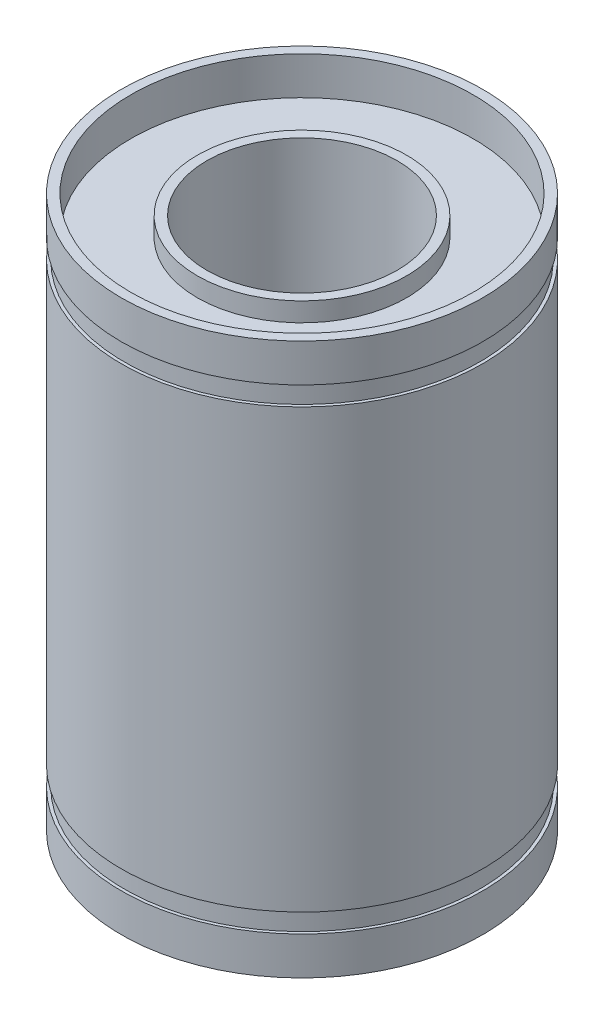
ISO-10303-21;
HEADER;
FILE_DESCRIPTION(('STEP AP214'),'2;1');
FILE_NAME('part.step','',(''),(''),'','','');
FILE_SCHEMA(('AUTOMOTIVE_DESIGN { 1 0 10303 214 1 1 1 1 }'));
ENDSEC;
DATA;
#1=APPLICATION_CONTEXT('core data for automotive mechanical design processes');
#2=APPLICATION_PROTOCOL_DEFINITION('international standard','automotive_design',2000,#1);
#3=PRODUCT_CONTEXT('',#1,'mechanical');
#4=PRODUCT('Part','Part','',(#3));
#5=PRODUCT_RELATED_PRODUCT_CATEGORY('part','',(#4));
#6=PRODUCT_DEFINITION_FORMATION('','',#4);
#7=PRODUCT_DEFINITION_CONTEXT('part definition',#1,'design');
#8=PRODUCT_DEFINITION('design','',#6,#7);
#9=PRODUCT_DEFINITION_SHAPE('','',#8);
#10=(LENGTH_UNIT() NAMED_UNIT(*) SI_UNIT(.MILLI.,.METRE.));
#11=(NAMED_UNIT(*) PLANE_ANGLE_UNIT() SI_UNIT($,.RADIAN.));
#12=(NAMED_UNIT(*) SI_UNIT($,.STERADIAN.) SOLID_ANGLE_UNIT());
#13=UNCERTAINTY_MEASURE_WITH_UNIT(LENGTH_MEASURE(1.E-05),#10,'distance_accuracy_value','');
#14=(GEOMETRIC_REPRESENTATION_CONTEXT(3) GLOBAL_UNCERTAINTY_ASSIGNED_CONTEXT((#13)) GLOBAL_UNIT_ASSIGNED_CONTEXT((#10,
#11,#12)) REPRESENTATION_CONTEXT('',''));
#15=CARTESIAN_POINT('',(0.,0.,0.));
#16=DIRECTION('',(0.,0.,1.));
#17=DIRECTION('',(1.,0.,0.));
#18=AXIS2_PLACEMENT_3D('',#15,#16,#17);
#19=CARTESIAN_POINT('',(0.,-19.,0.));
#20=DIRECTION('',(0.,-1.,0.));
#21=DIRECTION('',(0.,0.,-1.));
#22=AXIS2_PLACEMENT_3D('',#19,#20,#21);
#23=PLANE('',#22);
#24=CARTESIAN_POINT('',(0.,-19.,0.));
#25=DIRECTION('',(0.,-1.,0.));
#26=DIRECTION('',(0.,0.,-1.));
#27=AXIS2_PLACEMENT_3D('',#24,#25,#26);
#28=CIRCLE('',#27,9.);
#29=CARTESIAN_POINT('',(0.,-19.,-9.));
#30=VERTEX_POINT('',#29);
#31=EDGE_CURVE('E74',#30,#30,#28,.T.);
#32=ORIENTED_EDGE('',*,*,#31,.T.);
#33=EDGE_LOOP('',(#32));
#34=FACE_BOUND('',#33,.T.);
#35=CARTESIAN_POINT('',(0.,-19.,0.));
#36=DIRECTION('',(0.,-1.,0.));
#37=DIRECTION('',(0.,0.,-1.));
#38=AXIS2_PLACEMENT_3D('',#35,#36,#37);
#39=CIRCLE('',#38,5.5);
#40=CARTESIAN_POINT('',(0.,-19.,-5.5));
#41=VERTEX_POINT('',#40);
#42=EDGE_CURVE('E92',#41,#41,#39,.T.);
#43=ORIENTED_EDGE('',*,*,#42,.F.);
#44=EDGE_LOOP('',(#43));
#45=FACE_BOUND('',#44,.T.);
#46=ADVANCED_FACE('F32',(#34,#45),#23,.T.);
#47=CARTESIAN_POINT('',(0.,6.,0.));
#48=DIRECTION('',(0.,1.,0.));
#49=DIRECTION('',(0.,0.,1.));
#50=AXIS2_PLACEMENT_3D('',#47,#48,#49);
#51=PLANE('',#50);
#52=CARTESIAN_POINT('',(0.,6.,0.));
#53=DIRECTION('',(0.,1.,0.));
#54=DIRECTION('',(0.,0.,1.));
#55=AXIS2_PLACEMENT_3D('',#52,#53,#54);
#56=CIRCLE('',#55,9.);
#57=CARTESIAN_POINT('',(0.,6.,9.));
#58=VERTEX_POINT('',#57);
#59=EDGE_CURVE('E10',#58,#58,#56,.F.);
#60=ORIENTED_EDGE('',*,*,#59,.F.);
#61=EDGE_LOOP('',(#60));
#62=FACE_BOUND('',#61,.T.);
#63=CARTESIAN_POINT('',(0.,6.,0.));
#64=DIRECTION('',(0.,1.,0.));
#65=DIRECTION('',(0.,0.,1.));
#66=AXIS2_PLACEMENT_3D('',#63,#64,#65);
#67=CIRCLE('',#66,5.5);
#68=CARTESIAN_POINT('',(0.,6.,5.5));
#69=VERTEX_POINT('',#68);
#70=EDGE_CURVE('E83',#69,#69,#67,.T.);
#71=ORIENTED_EDGE('',*,*,#70,.F.);
#72=EDGE_LOOP('',(#71));
#73=FACE_BOUND('',#72,.T.);
#74=ADVANCED_FACE('F34',(#62,#73),#51,.T.);
#75=CARTESIAN_POINT('',(0.,8.,0.));
#76=DIRECTION('',(0.,-1.,0.));
#77=DIRECTION('',(0.,0.,-1.));
#78=AXIS2_PLACEMENT_3D('',#75,#76,#77);
#79=CYLINDRICAL_SURFACE('',#78,5.);
#80=CARTESIAN_POINT('',(0.,7.,0.));
#81=DIRECTION('',(0.,1.,0.));
#82=DIRECTION('',(0.,0.,1.));
#83=AXIS2_PLACEMENT_3D('',#80,#81,#82);
#84=CIRCLE('',#83,5.);
#85=CARTESIAN_POINT('',(0.,7.,-5.));
#86=VERTEX_POINT('',#85);
#87=EDGE_CURVE('E86',#86,#86,#84,.T.);
#88=CARTESIAN_POINT('',(0.,-20.,0.));
#89=DIRECTION('',(0.,-1.,0.));
#90=DIRECTION('',(0.,0.,-1.));
#91=AXIS2_PLACEMENT_3D('',#88,#89,#90);
#92=CIRCLE('',#91,5.);
#93=CARTESIAN_POINT('',(0.,-20.,-5.));
#94=VERTEX_POINT('',#93);
#95=EDGE_CURVE('E95',#94,#94,#92,.T.);
#96=CARTESIAN_POINT('',(0.,7.,-5.));
#97=CARTESIAN_POINT('',(0.,6.71875,-5.));
#98=CARTESIAN_POINT('',(0.,6.4375,-5.));
#99=CARTESIAN_POINT('',(0.,5.875,-5.));
#100=CARTESIAN_POINT('',(0.,5.59375,-5.));
#101=CARTESIAN_POINT('',(0.,5.03125,-5.));
#102=CARTESIAN_POINT('',(0.,4.75,-5.));
#103=CARTESIAN_POINT('',(0.,4.1875,-5.));
#104=CARTESIAN_POINT('',(0.,3.90625,-5.));
#105=CARTESIAN_POINT('',(0.,3.34375,-5.));
#106=CARTESIAN_POINT('',(0.,3.0625,-5.));
#107=CARTESIAN_POINT('',(0.,2.5,-5.));
#108=CARTESIAN_POINT('',(0.,2.21875,-5.));
#109=CARTESIAN_POINT('',(0.,1.65625,-5.));
#110=CARTESIAN_POINT('',(0.,1.375,-5.));
#111=CARTESIAN_POINT('',(0.,0.812500000000001,-5.));
#112=CARTESIAN_POINT('',(0.,0.531250000000001,-5.));
#113=CARTESIAN_POINT('',(0.,-0.0312499999999989,-5.));
#114=CARTESIAN_POINT('',(0.,-0.312499999999999,-5.));
#115=CARTESIAN_POINT('',(0.,-0.874999999999999,-5.));
#116=CARTESIAN_POINT('',(0.,-1.15625,-5.));
#117=CARTESIAN_POINT('',(0.,-1.71875,-5.));
#118=CARTESIAN_POINT('',(0.,-2.,-5.));
#119=CARTESIAN_POINT('',(0.,-2.5625,-5.));
#120=CARTESIAN_POINT('',(0.,-2.84375,-5.));
#121=CARTESIAN_POINT('',(0.,-3.40625,-5.));
#122=CARTESIAN_POINT('',(0.,-3.6875,-5.));
#123=CARTESIAN_POINT('',(0.,-4.25,-5.));
#124=CARTESIAN_POINT('',(0.,-4.53125,-5.));
#125=CARTESIAN_POINT('',(0.,-5.09375,-5.));
#126=CARTESIAN_POINT('',(0.,-5.375,-5.));
#127=CARTESIAN_POINT('',(0.,-5.9375,-5.));
#128=CARTESIAN_POINT('',(0.,-6.21875,-5.));
#129=CARTESIAN_POINT('',(0.,-6.78125,-5.));
#130=CARTESIAN_POINT('',(0.,-7.0625,-5.));
#131=CARTESIAN_POINT('',(0.,-7.625,-5.));
#132=CARTESIAN_POINT('',(0.,-7.90625,-5.));
#133=CARTESIAN_POINT('',(0.,-8.46875,-5.));
#134=CARTESIAN_POINT('',(0.,-8.75,-5.));
#135=CARTESIAN_POINT('',(0.,-9.3125,-5.));
#136=CARTESIAN_POINT('',(0.,-9.59375,-5.));
#137=CARTESIAN_POINT('',(0.,-10.15625,-5.));
#138=CARTESIAN_POINT('',(0.,-10.4375,-5.));
#139=CARTESIAN_POINT('',(0.,-11.,-5.));
#140=CARTESIAN_POINT('',(0.,-11.28125,-5.));
#141=CARTESIAN_POINT('',(0.,-11.84375,-5.));
#142=CARTESIAN_POINT('',(0.,-12.125,-5.));
#143=CARTESIAN_POINT('',(0.,-12.6875,-5.));
#144=CARTESIAN_POINT('',(0.,-12.96875,-5.));
#145=CARTESIAN_POINT('',(0.,-13.53125,-5.));
#146=CARTESIAN_POINT('',(0.,-13.8125,-5.));
#147=CARTESIAN_POINT('',(0.,-14.375,-5.));
#148=CARTESIAN_POINT('',(0.,-14.65625,-5.));
#149=CARTESIAN_POINT('',(0.,-15.21875,-5.));
#150=CARTESIAN_POINT('',(0.,-15.5,-5.));
#151=CARTESIAN_POINT('',(0.,-16.0625,-5.));
#152=CARTESIAN_POINT('',(0.,-16.34375,-5.));
#153=CARTESIAN_POINT('',(0.,-16.90625,-5.));
#154=CARTESIAN_POINT('',(0.,-17.1875,-5.));
#155=CARTESIAN_POINT('',(0.,-17.75,-5.));
#156=CARTESIAN_POINT('',(0.,-18.03125,-5.));
#157=CARTESIAN_POINT('',(0.,-18.59375,-5.));
#158=CARTESIAN_POINT('',(0.,-18.875,-5.));
#159=CARTESIAN_POINT('',(0.,-19.4375,-5.));
#160=CARTESIAN_POINT('',(0.,-19.71875,-5.));
#161=CARTESIAN_POINT('',(0.,-20.,-5.));
#162=B_SPLINE_CURVE_WITH_KNOTS('',3,(#96,#97,#98,#99,#100,#101,#102,#103,#104,#105,#106,#107,
#108,#109,#110,#111,#112,#113,#114,#115,#116,#117,#118,#119,#120,#121,#122,#123,#124,#125,#126,
#127,#128,#129,#130,#131,#132,#133,#134,#135,#136,#137,#138,#139,#140,#141,#142,#143,#144,#145,
#146,#147,#148,#149,#150,#151,#152,#153,#154,#155,#156,#157,#158,#159,#160,#161),.UNSPECIFIED.,
.F.,.F.,(4,2,2,2,2,2,2,2,2,2,2,2,2,2,2,2,2,2,2,2,2,2,2,2,2,2,2,2,2,2,2,2,4),(0.,0.84375,1.6875,
2.53125,3.375,4.21875,5.0625,5.90625,6.75,7.59375,8.4375,9.28125,10.125,10.96875,11.8125,
12.65625,13.5,14.34375,15.1875,16.03125,16.875,17.71875,18.5625,19.40625,20.25,21.09375,21.9375,
22.78125,23.625,24.46875,25.3125,26.15625,27.),.UNSPECIFIED.);
#163=EDGE_CURVE('BSEAM101',#86,#94,#162,.T.);
#164=ORIENTED_EDGE('',*,*,#87,.T.);
#165=ORIENTED_EDGE('',*,*,#95,.T.);
#166=ORIENTED_EDGE('',*,*,#163,.T.);
#167=ORIENTED_EDGE('',*,*,#163,.F.);
#168=EDGE_LOOP('',(#164,#166,#165,#167));
#169=FACE_BOUND('',#168,.T.);
#170=ADVANCED_FACE('F101',(#169),#79,.F.);
#171=CARTESIAN_POINT('',(0.,-18.,0.));
#172=DIRECTION('',(0.,-1.,0.));
#173=DIRECTION('',(0.,0.,-1.));
#174=AXIS2_PLACEMENT_3D('',#171,#172,#173);
#175=PLANE('',#174);
#176=CARTESIAN_POINT('',(0.,-18.,0.));
#177=DIRECTION('',(0.,-1.,0.));
#178=DIRECTION('',(0.,0.,-1.));
#179=AXIS2_PLACEMENT_3D('',#176,#177,#178);
#180=CIRCLE('',#179,9.5);
#181=CARTESIAN_POINT('',(0.,-18.,-9.5));
#182=VERTEX_POINT('',#181);
#183=EDGE_CURVE('E58',#182,#182,#180,.T.);
#184=ORIENTED_EDGE('',*,*,#183,.T.);
#185=EDGE_LOOP('',(#184));
#186=FACE_BOUND('',#185,.T.);
#187=CARTESIAN_POINT('',(0.,-18.,0.));
#188=DIRECTION('',(0.,-1.,0.));
#189=DIRECTION('',(0.,0.,-1.));
#190=AXIS2_PLACEMENT_3D('',#187,#188,#189);
#191=CIRCLE('',#190,9.34144595489267);
#192=CARTESIAN_POINT('',(0.,-18.,-9.34144595489267));
#193=VERTEX_POINT('',#192);
#194=EDGE_CURVE('E65',#193,#193,#191,.T.);
#195=ORIENTED_EDGE('',*,*,#194,.F.);
#196=EDGE_LOOP('',(#195));
#197=FACE_BOUND('',#196,.T.);
#198=ADVANCED_FACE('F135',(#186,#197),#175,.T.);
#199=CARTESIAN_POINT('',(0.,6.,0.));
#200=DIRECTION('',(0.,-1.,0.));
#201=DIRECTION('',(0.,0.,-1.));
#202=AXIS2_PLACEMENT_3D('',#199,#200,#201);
#203=CYLINDRICAL_SURFACE('',#202,9.34144595489267);
#204=CARTESIAN_POINT('',(0.,6.,0.));
#205=DIRECTION('',(0.,1.,0.));
#206=DIRECTION('',(0.,0.,1.));
#207=AXIS2_PLACEMENT_3D('',#204,#205,#206);
#208=CIRCLE('',#207,9.34144595489267);
#209=CARTESIAN_POINT('',(0.,6.,9.34144595489267));
#210=VERTEX_POINT('',#209);
#211=EDGE_CURVE('E39',#210,#210,#208,.F.);
#212=ORIENTED_EDGE('',*,*,#211,.T.);
#213=EDGE_LOOP('',(#212));
#214=FACE_BOUND('',#213,.T.);
#215=CARTESIAN_POINT('',(0.,5.,0.));
#216=DIRECTION('',(0.,-1.,0.));
#217=DIRECTION('',(0.,0.,-1.));
#218=AXIS2_PLACEMENT_3D('',#215,#216,#217);
#219=CIRCLE('',#218,9.34144595489267);
#220=CARTESIAN_POINT('',(0.,5.,-9.34144595489267));
#221=VERTEX_POINT('',#220);
#222=EDGE_CURVE('E55',#221,#221,#219,.T.);
#223=ORIENTED_EDGE('',*,*,#222,.F.);
#224=EDGE_LOOP('',(#223));
#225=FACE_BOUND('',#224,.T.);
#226=ADVANCED_FACE('F155',(#214,#225),#203,.T.);
#227=CARTESIAN_POINT('',(0.,8.,0.));
#228=DIRECTION('',(0.,1.,0.));
#229=DIRECTION('',(0.,0.,1.));
#230=AXIS2_PLACEMENT_3D('',#227,#228,#229);
#231=PLANE('',#230);
#232=CARTESIAN_POINT('',(0.,8.,0.));
#233=DIRECTION('',(0.,1.,0.));
#234=DIRECTION('',(0.,0.,1.));
#235=AXIS2_PLACEMENT_3D('',#232,#233,#234);
#236=CIRCLE('',#235,9.5);
#237=CARTESIAN_POINT('',(0.,8.,9.5));
#238=VERTEX_POINT('',#237);
#239=EDGE_CURVE('E43',#238,#238,#236,.T.);
#240=ORIENTED_EDGE('',*,*,#239,.T.);
#241=EDGE_LOOP('',(#240));
#242=FACE_BOUND('',#241,.T.);
#243=CARTESIAN_POINT('',(0.,8.,0.));
#244=DIRECTION('',(0.,1.,0.));
#245=DIRECTION('',(0.,0.,1.));
#246=AXIS2_PLACEMENT_3D('',#243,#244,#245);
#247=CIRCLE('',#246,9.);
#248=CARTESIAN_POINT('',(0.,8.,9.));
#249=VERTEX_POINT('',#248);
#250=EDGE_CURVE('E51',#249,#249,#247,.T.);
#251=ORIENTED_EDGE('',*,*,#250,.F.);
#252=EDGE_LOOP('',(#251));
#253=FACE_BOUND('',#252,.T.);
#254=ADVANCED_FACE('F169',(#242,#253),#231,.T.);
#255=CARTESIAN_POINT('',(0.,6.,0.));
#256=DIRECTION('',(0.,1.,0.));
#257=DIRECTION('',(0.,0.,1.));
#258=AXIS2_PLACEMENT_3D('',#255,#256,#257);
#259=PLANE('',#258);
#260=ORIENTED_EDGE('',*,*,#211,.F.);
#261=EDGE_LOOP('',(#260));
#262=FACE_BOUND('',#261,.T.);
#263=CARTESIAN_POINT('',(0.,6.,0.));
#264=DIRECTION('',(0.,1.,0.));
#265=DIRECTION('',(0.,0.,1.));
#266=AXIS2_PLACEMENT_3D('',#263,#264,#265);
#267=CIRCLE('',#266,9.5);
#268=CARTESIAN_POINT('',(0.,6.,9.5));
#269=VERTEX_POINT('',#268);
#270=EDGE_CURVE('E47',#269,#269,#267,.T.);
#271=ORIENTED_EDGE('',*,*,#270,.F.);
#272=EDGE_LOOP('',(#271));
#273=FACE_BOUND('',#272,.T.);
#274=ADVANCED_FACE('F172',(#262,#273),#259,.F.);
#275=CARTESIAN_POINT('',(0.,8.,0.));
#276=DIRECTION('',(0.,-1.,0.));
#277=DIRECTION('',(0.,0.,-1.));
#278=AXIS2_PLACEMENT_3D('',#275,#276,#277);
#279=CYLINDRICAL_SURFACE('',#278,9.5);
#280=ORIENTED_EDGE('',*,*,#239,.F.);
#281=EDGE_LOOP('',(#280));
#282=FACE_BOUND('',#281,.T.);
#283=ORIENTED_EDGE('',*,*,#270,.T.);
#284=EDGE_LOOP('',(#283));
#285=FACE_BOUND('',#284,.T.);
#286=ADVANCED_FACE('F167',(#282,#285),#279,.T.);
#287=CARTESIAN_POINT('',(0.,8.,0.));
#288=DIRECTION('',(0.,-1.,0.));
#289=DIRECTION('',(0.,0.,-1.));
#290=AXIS2_PLACEMENT_3D('',#287,#288,#289);
#291=CYLINDRICAL_SURFACE('',#290,9.);
#292=ORIENTED_EDGE('',*,*,#250,.T.);
#293=EDGE_LOOP('',(#292));
#294=FACE_BOUND('',#293,.T.);
#295=ORIENTED_EDGE('',*,*,#59,.T.);
#296=EDGE_LOOP('',(#295));
#297=FACE_BOUND('',#296,.T.);
#298=ADVANCED_FACE('F163',(#294,#297),#291,.F.);
#299=CARTESIAN_POINT('',(0.,-18.,0.));
#300=DIRECTION('',(0.,1.,0.));
#301=DIRECTION('',(0.,0.,1.));
#302=AXIS2_PLACEMENT_3D('',#299,#300,#301);
#303=CYLINDRICAL_SURFACE('',#302,9.5);
#304=ORIENTED_EDGE('',*,*,#183,.F.);
#305=EDGE_LOOP('',(#304));
#306=FACE_BOUND('',#305,.T.);
#307=CARTESIAN_POINT('',(0.,5.,0.));
#308=DIRECTION('',(0.,-1.,0.));
#309=DIRECTION('',(0.,0.,-1.));
#310=AXIS2_PLACEMENT_3D('',#307,#308,#309);
#311=CIRCLE('',#310,9.5);
#312=CARTESIAN_POINT('',(0.,5.,-9.5));
#313=VERTEX_POINT('',#312);
#314=EDGE_CURVE('E59',#313,#313,#311,.T.);
#315=ORIENTED_EDGE('',*,*,#314,.T.);
#316=EDGE_LOOP('',(#315));
#317=FACE_BOUND('',#316,.T.);
#318=ADVANCED_FACE('F159',(#306,#317),#303,.T.);
#319=CARTESIAN_POINT('',(0.,5.,0.));
#320=DIRECTION('',(0.,-1.,0.));
#321=DIRECTION('',(0.,0.,-1.));
#322=AXIS2_PLACEMENT_3D('',#319,#320,#321);
#323=PLANE('',#322);
#324=ORIENTED_EDGE('',*,*,#222,.T.);
#325=EDGE_LOOP('',(#324));
#326=FACE_BOUND('',#325,.T.);
#327=ORIENTED_EDGE('',*,*,#314,.F.);
#328=EDGE_LOOP('',(#327));
#329=FACE_BOUND('',#328,.T.);
#330=ADVANCED_FACE('F151',(#326,#329),#323,.F.);
#331=CARTESIAN_POINT('',(0.,-19.,0.));
#332=DIRECTION('',(0.,1.,0.));
#333=DIRECTION('',(0.,0.,1.));
#334=AXIS2_PLACEMENT_3D('',#331,#332,#333);
#335=CYLINDRICAL_SURFACE('',#334,9.34144595489267);
#336=CARTESIAN_POINT('',(0.,-19.,0.));
#337=DIRECTION('',(0.,-1.,0.));
#338=DIRECTION('',(0.,0.,-1.));
#339=AXIS2_PLACEMENT_3D('',#336,#337,#338);
#340=CIRCLE('',#339,9.34144595489267);
#341=CARTESIAN_POINT('',(0.,-19.,-9.34144595489267));
#342=VERTEX_POINT('',#341);
#343=EDGE_CURVE('E62',#342,#342,#340,.T.);
#344=ORIENTED_EDGE('',*,*,#343,.F.);
#345=EDGE_LOOP('',(#344));
#346=FACE_BOUND('',#345,.T.);
#347=ORIENTED_EDGE('',*,*,#194,.T.);
#348=EDGE_LOOP('',(#347));
#349=FACE_BOUND('',#348,.T.);
#350=ADVANCED_FACE('F144',(#346,#349),#335,.T.);
#351=CARTESIAN_POINT('',(0.,-19.,0.));
#352=DIRECTION('',(0.,-1.,0.));
#353=DIRECTION('',(0.,0.,-1.));
#354=AXIS2_PLACEMENT_3D('',#351,#352,#353);
#355=PLANE('',#354);
#356=CARTESIAN_POINT('',(0.,-19.,0.));
#357=DIRECTION('',(0.,-1.,0.));
#358=DIRECTION('',(0.,0.,-1.));
#359=AXIS2_PLACEMENT_3D('',#356,#357,#358);
#360=CIRCLE('',#359,9.5);
#361=CARTESIAN_POINT('',(0.,-19.,-9.5));
#362=VERTEX_POINT('',#361);
#363=EDGE_CURVE('E71',#362,#362,#360,.T.);
#364=ORIENTED_EDGE('',*,*,#363,.F.);
#365=EDGE_LOOP('',(#364));
#366=FACE_BOUND('',#365,.T.);
#367=ORIENTED_EDGE('',*,*,#343,.T.);
#368=EDGE_LOOP('',(#367));
#369=FACE_BOUND('',#368,.T.);
#370=ADVANCED_FACE('F141',(#366,#369),#355,.F.);
#371=CARTESIAN_POINT('',(0.,-21.,0.));
#372=DIRECTION('',(0.,1.,0.));
#373=DIRECTION('',(0.,0.,1.));
#374=AXIS2_PLACEMENT_3D('',#371,#372,#373);
#375=CYLINDRICAL_SURFACE('',#374,9.5);
#376=CARTESIAN_POINT('',(0.,-21.,0.));
#377=DIRECTION('',(0.,-1.,0.));
#378=DIRECTION('',(0.,0.,-1.));
#379=AXIS2_PLACEMENT_3D('',#376,#377,#378);
#380=CIRCLE('',#379,9.5);
#381=CARTESIAN_POINT('',(0.,-21.,-9.5));
#382=VERTEX_POINT('',#381);
#383=EDGE_CURVE('E68',#382,#382,#380,.T.);
#384=ORIENTED_EDGE('',*,*,#383,.F.);
#385=EDGE_LOOP('',(#384));
#386=FACE_BOUND('',#385,.T.);
#387=ORIENTED_EDGE('',*,*,#363,.T.);
#388=EDGE_LOOP('',(#387));
#389=FACE_BOUND('',#388,.T.);
#390=ADVANCED_FACE('F139',(#386,#389),#375,.T.);
#391=CARTESIAN_POINT('',(0.,-21.,0.));
#392=DIRECTION('',(0.,-1.,0.));
#393=DIRECTION('',(0.,0.,-1.));
#394=AXIS2_PLACEMENT_3D('',#391,#392,#393);
#395=PLANE('',#394);
#396=CARTESIAN_POINT('',(0.,-21.,0.));
#397=DIRECTION('',(0.,-1.,0.));
#398=DIRECTION('',(0.,0.,-1.));
#399=AXIS2_PLACEMENT_3D('',#396,#397,#398);
#400=CIRCLE('',#399,9.);
#401=CARTESIAN_POINT('',(0.,-21.,-9.));
#402=VERTEX_POINT('',#401);
#403=EDGE_CURVE('E77',#402,#402,#400,.T.);
#404=ORIENTED_EDGE('',*,*,#403,.F.);
#405=EDGE_LOOP('',(#404));
#406=FACE_BOUND('',#405,.T.);
#407=ORIENTED_EDGE('',*,*,#383,.T.);
#408=EDGE_LOOP('',(#407));
#409=FACE_BOUND('',#408,.T.);
#410=ADVANCED_FACE('F131',(#406,#409),#395,.T.);
#411=CARTESIAN_POINT('',(0.,-19.,0.));
#412=DIRECTION('',(0.,-1.,0.));
#413=DIRECTION('',(0.,0.,-1.));
#414=AXIS2_PLACEMENT_3D('',#411,#412,#413);
#415=CYLINDRICAL_SURFACE('',#414,9.);
#416=ORIENTED_EDGE('',*,*,#31,.F.);
#417=EDGE_LOOP('',(#416));
#418=FACE_BOUND('',#417,.T.);
#419=ORIENTED_EDGE('',*,*,#403,.T.);
#420=EDGE_LOOP('',(#419));
#421=FACE_BOUND('',#420,.T.);
#422=ADVANCED_FACE('F128',(#418,#421),#415,.F.);
#423=CARTESIAN_POINT('',(0.,7.,0.));
#424=DIRECTION('',(0.,1.,0.));
#425=DIRECTION('',(0.,0.,1.));
#426=AXIS2_PLACEMENT_3D('',#423,#424,#425);
#427=PLANE('',#426);
#428=CARTESIAN_POINT('',(0.,7.,0.));
#429=DIRECTION('',(0.,1.,0.));
#430=DIRECTION('',(0.,0.,1.));
#431=AXIS2_PLACEMENT_3D('',#428,#429,#430);
#432=CIRCLE('',#431,5.5);
#433=CARTESIAN_POINT('',(0.,7.,5.5));
#434=VERTEX_POINT('',#433);
#435=EDGE_CURVE('E80',#434,#434,#432,.T.);
#436=ORIENTED_EDGE('',*,*,#435,.T.);
#437=EDGE_LOOP('',(#436));
#438=FACE_BOUND('',#437,.T.);
#439=ORIENTED_EDGE('',*,*,#87,.F.);
#440=EDGE_LOOP('',(#439));
#441=FACE_BOUND('',#440,.T.);
#442=ADVANCED_FACE('F115',(#438,#441),#427,.T.);
#443=CARTESIAN_POINT('',(0.,7.,0.));
#444=DIRECTION('',(0.,-1.,0.));
#445=DIRECTION('',(0.,0.,-1.));
#446=AXIS2_PLACEMENT_3D('',#443,#444,#445);
#447=CYLINDRICAL_SURFACE('',#446,5.5);
#448=ORIENTED_EDGE('',*,*,#435,.F.);
#449=EDGE_LOOP('',(#448));
#450=FACE_BOUND('',#449,.T.);
#451=ORIENTED_EDGE('',*,*,#70,.T.);
#452=EDGE_LOOP('',(#451));
#453=FACE_BOUND('',#452,.T.);
#454=ADVANCED_FACE('F106',(#450,#453),#447,.T.);
#455=CARTESIAN_POINT('',(0.,-20.,0.));
#456=DIRECTION('',(0.,-1.,0.));
#457=DIRECTION('',(0.,0.,-1.));
#458=AXIS2_PLACEMENT_3D('',#455,#456,#457);
#459=PLANE('',#458);
#460=CARTESIAN_POINT('',(0.,-20.,0.));
#461=DIRECTION('',(0.,-1.,0.));
#462=DIRECTION('',(0.,0.,-1.));
#463=AXIS2_PLACEMENT_3D('',#460,#461,#462);
#464=CIRCLE('',#463,5.5);
#465=CARTESIAN_POINT('',(0.,-20.,-5.5));
#466=VERTEX_POINT('',#465);
#467=EDGE_CURVE('E91',#466,#466,#464,.T.);
#468=ORIENTED_EDGE('',*,*,#467,.T.);
#469=EDGE_LOOP('',(#468));
#470=FACE_BOUND('',#469,.T.);
#471=ORIENTED_EDGE('',*,*,#95,.F.);
#472=EDGE_LOOP('',(#471));
#473=FACE_BOUND('',#472,.T.);
#474=ADVANCED_FACE('F103',(#470,#473),#459,.T.);
#475=CARTESIAN_POINT('',(0.,-20.,0.));
#476=DIRECTION('',(0.,1.,0.));
#477=DIRECTION('',(0.,0.,1.));
#478=AXIS2_PLACEMENT_3D('',#475,#476,#477);
#479=CYLINDRICAL_SURFACE('',#478,5.5);
#480=ORIENTED_EDGE('',*,*,#467,.F.);
#481=EDGE_LOOP('',(#480));
#482=FACE_BOUND('',#481,.T.);
#483=ORIENTED_EDGE('',*,*,#42,.T.);
#484=EDGE_LOOP('',(#483));
#485=FACE_BOUND('',#484,.T.);
#486=ADVANCED_FACE('F105',(#482,#485),#479,.T.);
#487=CLOSED_SHELL('',(#46,#74,#170,#198,#226,#254,#274,#286,#298,#318,#330,#350,#370,#390,#410,
#422,#442,#454,#474,#486));
#488=MANIFOLD_SOLID_BREP('B2',#487);
#489=ADVANCED_BREP_SHAPE_REPRESENTATION('',(#18,#488),#14);
#490=SHAPE_DEFINITION_REPRESENTATION(#9,#489);
ENDSEC;
END-ISO-10303-21;
